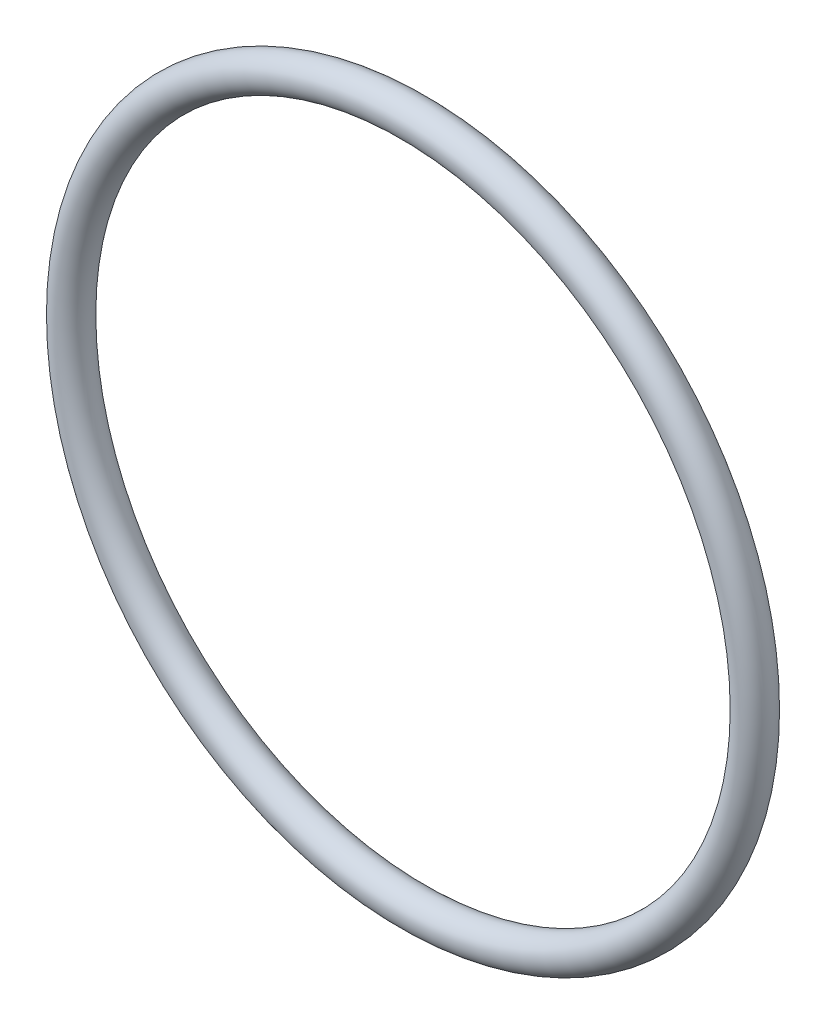
ISO-10303-21;
HEADER;
FILE_DESCRIPTION(('STEP AP214'),'2;1');
FILE_NAME('part.step','',(''),(''),'','','');
FILE_SCHEMA(('AUTOMOTIVE_DESIGN { 1 0 10303 214 1 1 1 1 }'));
ENDSEC;
DATA;
#1=APPLICATION_CONTEXT('core data for automotive mechanical design processes');
#2=APPLICATION_PROTOCOL_DEFINITION('international standard','automotive_design',2000,#1);
#3=PRODUCT_CONTEXT('',#1,'mechanical');
#4=PRODUCT('Part','Part','',(#3));
#5=PRODUCT_RELATED_PRODUCT_CATEGORY('part','',(#4));
#6=PRODUCT_DEFINITION_FORMATION('','',#4);
#7=PRODUCT_DEFINITION_CONTEXT('part definition',#1,'design');
#8=PRODUCT_DEFINITION('design','',#6,#7);
#9=PRODUCT_DEFINITION_SHAPE('','',#8);
#10=(LENGTH_UNIT() NAMED_UNIT(*) SI_UNIT(.MILLI.,.METRE.));
#11=(NAMED_UNIT(*) PLANE_ANGLE_UNIT() SI_UNIT($,.RADIAN.));
#12=(NAMED_UNIT(*) SI_UNIT($,.STERADIAN.) SOLID_ANGLE_UNIT());
#13=UNCERTAINTY_MEASURE_WITH_UNIT(LENGTH_MEASURE(1.E-05),#10,'distance_accuracy_value','');
#14=(GEOMETRIC_REPRESENTATION_CONTEXT(3) GLOBAL_UNCERTAINTY_ASSIGNED_CONTEXT((#13)) GLOBAL_UNIT_ASSIGNED_CONTEXT((#10,
#11,#12)) REPRESENTATION_CONTEXT('',''));
#15=CARTESIAN_POINT('',(0.,0.,0.));
#16=DIRECTION('',(0.,0.,1.));
#17=DIRECTION('',(1.,0.,0.));
#18=AXIS2_PLACEMENT_3D('',#15,#16,#17);
#19=CARTESIAN_POINT('',(0.,0.,0.));
#20=DIRECTION('',(0.,0.,1.));
#21=DIRECTION('',(1.,0.,0.));
#22=AXIS2_PLACEMENT_3D('',#19,#20,#21);
#23=TOROIDAL_SURFACE('',#22,17.4117,0.888999999999996);
#24=CARTESIAN_POINT('',(18.3007,0.,0.));
#25=VERTEX_POINT('',#24);
#26=VERTEX_LOOP('',#25);
#27=FACE_BOUND('',#26,.T.);
#28=ADVANCED_FACE('F35',(#27),#23,.T.);
#29=CLOSED_SHELL('',(#28));
#30=MANIFOLD_SOLID_BREP('B2',#29);
#31=ADVANCED_BREP_SHAPE_REPRESENTATION('',(#18,#30),#14);
#32=SHAPE_DEFINITION_REPRESENTATION(#9,#31);
ENDSEC;
END-ISO-10303-21;
